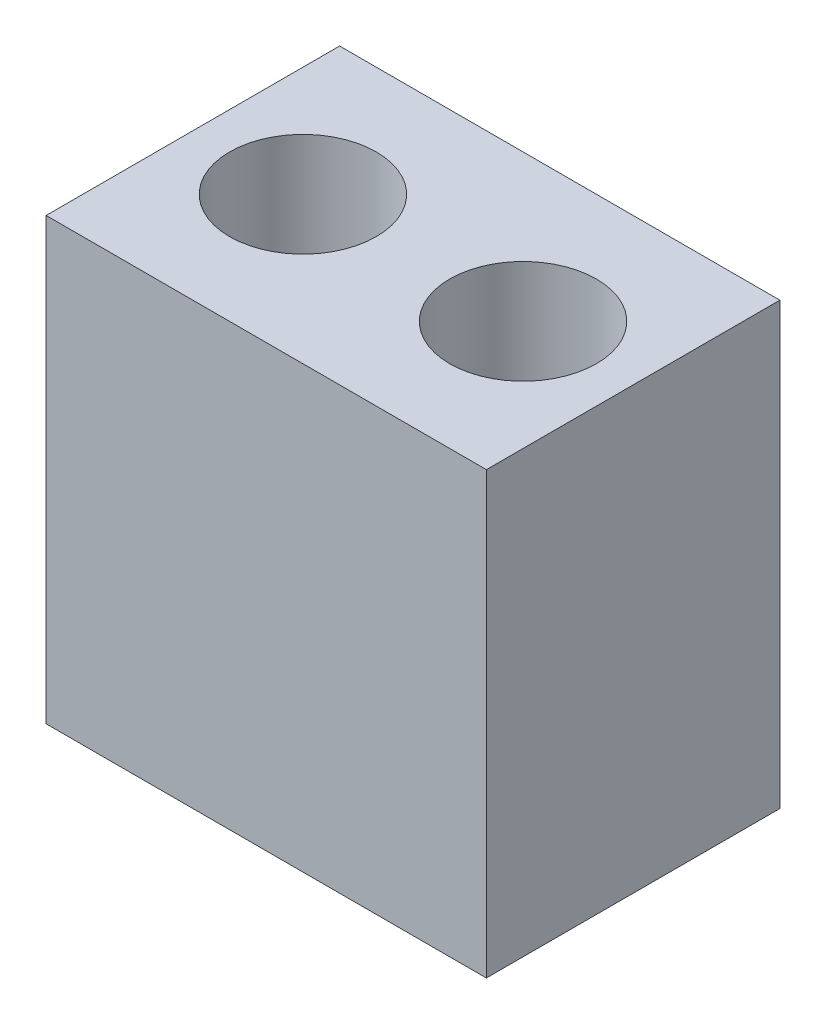
ISO-10303-21;
HEADER;
FILE_DESCRIPTION(('STEP AP214'),'2;1');
FILE_NAME('part.step','',(''),(''),'','','');
FILE_SCHEMA(('AUTOMOTIVE_DESIGN { 1 0 10303 214 1 1 1 1 }'));
ENDSEC;
DATA;
#1=APPLICATION_CONTEXT('core data for automotive mechanical design processes');
#2=APPLICATION_PROTOCOL_DEFINITION('international standard','automotive_design',2000,#1);
#3=PRODUCT_CONTEXT('',#1,'mechanical');
#4=PRODUCT('Part','Part','',(#3));
#5=PRODUCT_RELATED_PRODUCT_CATEGORY('part','',(#4));
#6=PRODUCT_DEFINITION_FORMATION('','',#4);
#7=PRODUCT_DEFINITION_CONTEXT('part definition',#1,'design');
#8=PRODUCT_DEFINITION('design','',#6,#7);
#9=PRODUCT_DEFINITION_SHAPE('','',#8);
#10=(LENGTH_UNIT() NAMED_UNIT(*) SI_UNIT(.MILLI.,.METRE.));
#11=(NAMED_UNIT(*) PLANE_ANGLE_UNIT() SI_UNIT($,.RADIAN.));
#12=(NAMED_UNIT(*) SI_UNIT($,.STERADIAN.) SOLID_ANGLE_UNIT());
#13=UNCERTAINTY_MEASURE_WITH_UNIT(LENGTH_MEASURE(1.E-05),#10,'distance_accuracy_value','');
#14=(GEOMETRIC_REPRESENTATION_CONTEXT(3) GLOBAL_UNCERTAINTY_ASSIGNED_CONTEXT((#13)) GLOBAL_UNIT_ASSIGNED_CONTEXT((#10,
#11,#12)) REPRESENTATION_CONTEXT('',''));
#15=CARTESIAN_POINT('',(0.,0.,0.));
#16=DIRECTION('',(0.,0.,1.));
#17=DIRECTION('',(1.,0.,0.));
#18=AXIS2_PLACEMENT_3D('',#15,#16,#17);
#19=CARTESIAN_POINT('',(7.5,-15.,10.));
#20=DIRECTION('',(0.,1.,0.));
#21=DIRECTION('',(0.,0.,1.));
#22=AXIS2_PLACEMENT_3D('',#19,#20,#21);
#23=CYLINDRICAL_SURFACE('',#22,2.53);
#24=CARTESIAN_POINT('',(7.5,-15.,10.));
#25=DIRECTION('',(0.,1.,0.));
#26=DIRECTION('',(0.,0.,1.));
#27=AXIS2_PLACEMENT_3D('',#24,#25,#26);
#28=CIRCLE('',#27,2.53);
#29=CARTESIAN_POINT('',(7.5,-15.,12.53));
#30=VERTEX_POINT('',#29);
#31=EDGE_CURVE('E113',#30,#30,#28,.T.);
#32=CARTESIAN_POINT('',(7.5,0.,10.));
#33=DIRECTION('',(0.,1.,0.));
#34=DIRECTION('',(0.,0.,1.));
#35=AXIS2_PLACEMENT_3D('',#32,#33,#34);
#36=CIRCLE('',#35,2.53);
#37=CARTESIAN_POINT('',(7.5,0.,12.53));
#38=VERTEX_POINT('',#37);
#39=EDGE_CURVE('E37',#38,#38,#36,.F.);
#40=CARTESIAN_POINT('',(7.5,-15.,12.53));
#41=CARTESIAN_POINT('',(7.5,-14.84375,12.53));
#42=CARTESIAN_POINT('',(7.5,-14.6875,12.53));
#43=CARTESIAN_POINT('',(7.5,-14.375,12.53));
#44=CARTESIAN_POINT('',(7.5,-14.21875,12.53));
#45=CARTESIAN_POINT('',(7.5,-13.90625,12.53));
#46=CARTESIAN_POINT('',(7.5,-13.75,12.53));
#47=CARTESIAN_POINT('',(7.5,-13.4375,12.53));
#48=CARTESIAN_POINT('',(7.5,-13.28125,12.53));
#49=CARTESIAN_POINT('',(7.5,-12.96875,12.53));
#50=CARTESIAN_POINT('',(7.5,-12.8125,12.53));
#51=CARTESIAN_POINT('',(7.5,-12.5,12.53));
#52=CARTESIAN_POINT('',(7.5,-12.34375,12.53));
#53=CARTESIAN_POINT('',(7.5,-12.03125,12.53));
#54=CARTESIAN_POINT('',(7.5,-11.875,12.53));
#55=CARTESIAN_POINT('',(7.5,-11.5625,12.53));
#56=CARTESIAN_POINT('',(7.5,-11.40625,12.53));
#57=CARTESIAN_POINT('',(7.5,-11.09375,12.53));
#58=CARTESIAN_POINT('',(7.5,-10.9375,12.53));
#59=CARTESIAN_POINT('',(7.5,-10.625,12.53));
#60=CARTESIAN_POINT('',(7.5,-10.46875,12.53));
#61=CARTESIAN_POINT('',(7.5,-10.15625,12.53));
#62=CARTESIAN_POINT('',(7.5,-10.,12.53));
#63=CARTESIAN_POINT('',(7.5,-9.6875,12.53));
#64=CARTESIAN_POINT('',(7.5,-9.53125,12.53));
#65=CARTESIAN_POINT('',(7.5,-9.21875,12.53));
#66=CARTESIAN_POINT('',(7.5,-9.0625,12.53));
#67=CARTESIAN_POINT('',(7.5,-8.75,12.53));
#68=CARTESIAN_POINT('',(7.5,-8.59375,12.53));
#69=CARTESIAN_POINT('',(7.5,-8.28125,12.53));
#70=CARTESIAN_POINT('',(7.5,-8.125,12.53));
#71=CARTESIAN_POINT('',(7.5,-7.8125,12.53));
#72=CARTESIAN_POINT('',(7.5,-7.65625,12.53));
#73=CARTESIAN_POINT('',(7.5,-7.34375,12.53));
#74=CARTESIAN_POINT('',(7.5,-7.1875,12.53));
#75=CARTESIAN_POINT('',(7.5,-6.875,12.53));
#76=CARTESIAN_POINT('',(7.5,-6.71875,12.53));
#77=CARTESIAN_POINT('',(7.5,-6.40625,12.53));
#78=CARTESIAN_POINT('',(7.5,-6.25,12.53));
#79=CARTESIAN_POINT('',(7.5,-5.9375,12.53));
#80=CARTESIAN_POINT('',(7.5,-5.78125,12.53));
#81=CARTESIAN_POINT('',(7.5,-5.46875,12.53));
#82=CARTESIAN_POINT('',(7.5,-5.3125,12.53));
#83=CARTESIAN_POINT('',(7.5,-5.,12.53));
#84=CARTESIAN_POINT('',(7.5,-4.84375,12.53));
#85=CARTESIAN_POINT('',(7.5,-4.53125,12.53));
#86=CARTESIAN_POINT('',(7.5,-4.375,12.53));
#87=CARTESIAN_POINT('',(7.5,-4.0625,12.53));
#88=CARTESIAN_POINT('',(7.5,-3.90625,12.53));
#89=CARTESIAN_POINT('',(7.5,-3.59375,12.53));
#90=CARTESIAN_POINT('',(7.5,-3.4375,12.53));
#91=CARTESIAN_POINT('',(7.5,-3.125,12.53));
#92=CARTESIAN_POINT('',(7.5,-2.96875,12.53));
#93=CARTESIAN_POINT('',(7.5,-2.65625,12.53));
#94=CARTESIAN_POINT('',(7.5,-2.5,12.53));
#95=CARTESIAN_POINT('',(7.5,-2.1875,12.53));
#96=CARTESIAN_POINT('',(7.5,-2.03125,12.53));
#97=CARTESIAN_POINT('',(7.5,-1.71875,12.53));
#98=CARTESIAN_POINT('',(7.5,-1.5625,12.53));
#99=CARTESIAN_POINT('',(7.5,-1.25,12.53));
#100=CARTESIAN_POINT('',(7.5,-1.09375,12.53));
#101=CARTESIAN_POINT('',(7.5,-0.781250000000005,12.53));
#102=CARTESIAN_POINT('',(7.5,-0.625000000000005,12.53));
#103=CARTESIAN_POINT('',(7.5,-0.312500000000005,12.53));
#104=CARTESIAN_POINT('',(7.5,-0.156250000000005,12.53));
#105=CARTESIAN_POINT('',(7.5,0.,12.53));
#106=B_SPLINE_CURVE_WITH_KNOTS('',3,(#40,#41,#42,#43,#44,#45,#46,#47,#48,#49,#50,#51,#52,#53,
#54,#55,#56,#57,#58,#59,#60,#61,#62,#63,#64,#65,#66,#67,#68,#69,#70,#71,#72,#73,#74,#75,#76,#77,
#78,#79,#80,#81,#82,#83,#84,#85,#86,#87,#88,#89,#90,#91,#92,#93,#94,#95,#96,#97,#98,#99,#100,
#101,#102,#103,#104,#105),.UNSPECIFIED.,.F.,.F.,(4,2,2,2,2,2,2,2,2,2,2,2,2,2,2,2,2,2,2,2,2,2,2,
2,2,2,2,2,2,2,2,2,4),(0.,0.468749999999999,0.937499999999999,1.40625,1.875,2.34375,2.8125,
3.28125,3.75,4.21875,4.6875,5.15625,5.625,6.09375,6.5625,7.03125,7.5,7.96875,8.43749999999999,
8.90625,9.375,9.84374999999999,10.3125,10.78125,11.25,11.71875,12.1875,12.65625,13.125,13.59375,
14.0625,14.53125,15.),.UNSPECIFIED.);
#107=EDGE_CURVE('BSEAM33',#30,#38,#106,.T.);
#108=ORIENTED_EDGE('',*,*,#31,.F.);
#109=ORIENTED_EDGE('',*,*,#39,.F.);
#110=ORIENTED_EDGE('',*,*,#107,.T.);
#111=ORIENTED_EDGE('',*,*,#107,.F.);
#112=EDGE_LOOP('',(#108,#110,#109,#111));
#113=FACE_BOUND('',#112,.T.);
#114=ADVANCED_FACE('F33',(#113),#23,.F.);
#115=CARTESIAN_POINT('',(-7.5,-15.,10.));
#116=DIRECTION('',(0.,1.,0.));
#117=DIRECTION('',(0.,0.,1.));
#118=AXIS2_PLACEMENT_3D('',#115,#116,#117);
#119=CYLINDRICAL_SURFACE('',#118,3.);
#120=CARTESIAN_POINT('',(-7.5,-15.,10.));
#121=DIRECTION('',(0.,1.,0.));
#122=DIRECTION('',(0.,0.,1.));
#123=AXIS2_PLACEMENT_3D('',#120,#121,#122);
#124=CIRCLE('',#123,3.);
#125=CARTESIAN_POINT('',(-7.5,-15.,13.));
#126=VERTEX_POINT('',#125);
#127=EDGE_CURVE('E106',#126,#126,#124,.T.);
#128=CARTESIAN_POINT('',(-7.5,0.,10.));
#129=DIRECTION('',(0.,1.,0.));
#130=DIRECTION('',(0.,0.,1.));
#131=AXIS2_PLACEMENT_3D('',#128,#129,#130);
#132=CIRCLE('',#131,3.);
#133=CARTESIAN_POINT('',(-7.5,0.,13.));
#134=VERTEX_POINT('',#133);
#135=EDGE_CURVE('E111',#134,#134,#132,.F.);
#136=CARTESIAN_POINT('',(-7.5,-15.,13.));
#137=CARTESIAN_POINT('',(-7.5,-14.84375,13.));
#138=CARTESIAN_POINT('',(-7.5,-14.6875,13.));
#139=CARTESIAN_POINT('',(-7.5,-14.375,13.));
#140=CARTESIAN_POINT('',(-7.5,-14.21875,13.));
#141=CARTESIAN_POINT('',(-7.5,-13.90625,13.));
#142=CARTESIAN_POINT('',(-7.5,-13.75,13.));
#143=CARTESIAN_POINT('',(-7.5,-13.4375,13.));
#144=CARTESIAN_POINT('',(-7.5,-13.28125,13.));
#145=CARTESIAN_POINT('',(-7.5,-12.96875,13.));
#146=CARTESIAN_POINT('',(-7.5,-12.8125,13.));
#147=CARTESIAN_POINT('',(-7.5,-12.5,13.));
#148=CARTESIAN_POINT('',(-7.5,-12.34375,13.));
#149=CARTESIAN_POINT('',(-7.5,-12.03125,13.));
#150=CARTESIAN_POINT('',(-7.5,-11.875,13.));
#151=CARTESIAN_POINT('',(-7.5,-11.5625,13.));
#152=CARTESIAN_POINT('',(-7.5,-11.40625,13.));
#153=CARTESIAN_POINT('',(-7.5,-11.09375,13.));
#154=CARTESIAN_POINT('',(-7.5,-10.9375,13.));
#155=CARTESIAN_POINT('',(-7.5,-10.625,13.));
#156=CARTESIAN_POINT('',(-7.5,-10.46875,13.));
#157=CARTESIAN_POINT('',(-7.5,-10.15625,13.));
#158=CARTESIAN_POINT('',(-7.5,-10.,13.));
#159=CARTESIAN_POINT('',(-7.5,-9.6875,13.));
#160=CARTESIAN_POINT('',(-7.5,-9.53125,13.));
#161=CARTESIAN_POINT('',(-7.5,-9.21875,13.));
#162=CARTESIAN_POINT('',(-7.5,-9.0625,13.));
#163=CARTESIAN_POINT('',(-7.5,-8.75,13.));
#164=CARTESIAN_POINT('',(-7.5,-8.59375,13.));
#165=CARTESIAN_POINT('',(-7.5,-8.28125,13.));
#166=CARTESIAN_POINT('',(-7.5,-8.125,13.));
#167=CARTESIAN_POINT('',(-7.5,-7.8125,13.));
#168=CARTESIAN_POINT('',(-7.5,-7.65625,13.));
#169=CARTESIAN_POINT('',(-7.5,-7.34375,13.));
#170=CARTESIAN_POINT('',(-7.5,-7.1875,13.));
#171=CARTESIAN_POINT('',(-7.5,-6.875,13.));
#172=CARTESIAN_POINT('',(-7.5,-6.71875,13.));
#173=CARTESIAN_POINT('',(-7.5,-6.40625,13.));
#174=CARTESIAN_POINT('',(-7.5,-6.25,13.));
#175=CARTESIAN_POINT('',(-7.5,-5.9375,13.));
#176=CARTESIAN_POINT('',(-7.5,-5.78125,13.));
#177=CARTESIAN_POINT('',(-7.5,-5.46875,13.));
#178=CARTESIAN_POINT('',(-7.5,-5.3125,13.));
#179=CARTESIAN_POINT('',(-7.5,-5.,13.));
#180=CARTESIAN_POINT('',(-7.5,-4.84375,13.));
#181=CARTESIAN_POINT('',(-7.5,-4.53125,13.));
#182=CARTESIAN_POINT('',(-7.5,-4.375,13.));
#183=CARTESIAN_POINT('',(-7.5,-4.0625,13.));
#184=CARTESIAN_POINT('',(-7.5,-3.90625,13.));
#185=CARTESIAN_POINT('',(-7.5,-3.59375,13.));
#186=CARTESIAN_POINT('',(-7.5,-3.4375,13.));
#187=CARTESIAN_POINT('',(-7.5,-3.125,13.));
#188=CARTESIAN_POINT('',(-7.5,-2.96875,13.));
#189=CARTESIAN_POINT('',(-7.5,-2.65625,13.));
#190=CARTESIAN_POINT('',(-7.5,-2.5,13.));
#191=CARTESIAN_POINT('',(-7.5,-2.1875,13.));
#192=CARTESIAN_POINT('',(-7.5,-2.03125,13.));
#193=CARTESIAN_POINT('',(-7.5,-1.71875,13.));
#194=CARTESIAN_POINT('',(-7.5,-1.5625,13.));
#195=CARTESIAN_POINT('',(-7.5,-1.25,13.));
#196=CARTESIAN_POINT('',(-7.5,-1.09375,13.));
#197=CARTESIAN_POINT('',(-7.5,-0.781250000000005,13.));
#198=CARTESIAN_POINT('',(-7.5,-0.625000000000005,13.));
#199=CARTESIAN_POINT('',(-7.5,-0.312500000000005,13.));
#200=CARTESIAN_POINT('',(-7.5,-0.156250000000005,13.));
#201=CARTESIAN_POINT('',(-7.5,0.,13.));
#202=B_SPLINE_CURVE_WITH_KNOTS('',3,(#136,#137,#138,#139,#140,#141,#142,#143,#144,#145,#146,
#147,#148,#149,#150,#151,#152,#153,#154,#155,#156,#157,#158,#159,#160,#161,#162,#163,#164,#165,
#166,#167,#168,#169,#170,#171,#172,#173,#174,#175,#176,#177,#178,#179,#180,#181,#182,#183,#184,
#185,#186,#187,#188,#189,#190,#191,#192,#193,#194,#195,#196,#197,#198,#199,#200,#201),
.UNSPECIFIED.,.F.,.F.,(4,2,2,2,2,2,2,2,2,2,2,2,2,2,2,2,2,2,2,2,2,2,2,2,2,2,2,2,2,2,2,2,4),(0.,
0.468749999999999,0.937499999999999,1.40625,1.875,2.34375,2.8125,3.28125,3.75,4.21875,4.6875,
5.15625,5.625,6.09375,6.5625,7.03125,7.5,7.96875,8.43749999999999,8.90625,9.375,
9.84374999999999,10.3125,10.78125,11.25,11.71875,12.1875,12.65625,13.125,13.59375,14.0625,
14.53125,15.),.UNSPECIFIED.);
#203=EDGE_CURVE('BSEAM133',#126,#134,#202,.T.);
#204=ORIENTED_EDGE('',*,*,#127,.F.);
#205=ORIENTED_EDGE('',*,*,#135,.F.);
#206=ORIENTED_EDGE('',*,*,#203,.T.);
#207=ORIENTED_EDGE('',*,*,#203,.F.);
#208=EDGE_LOOP('',(#204,#206,#205,#207));
#209=FACE_BOUND('',#208,.T.);
#210=ADVANCED_FACE('F133',(#209),#119,.F.);
#211=CARTESIAN_POINT('',(-15.,15.,20.));
#212=DIRECTION('',(0.,1.,0.));
#213=DIRECTION('',(0.,0.,1.));
#214=AXIS2_PLACEMENT_3D('',#211,#212,#213);
#215=PLANE('',#214);
#216=CARTESIAN_POINT('',(7.5,15.,10.));
#217=DIRECTION('',(0.,1.,0.));
#218=DIRECTION('',(0.,0.,1.));
#219=AXIS2_PLACEMENT_3D('',#216,#217,#218);
#220=CIRCLE('',#219,5.);
#221=CARTESIAN_POINT('',(7.5,15.,15.));
#222=VERTEX_POINT('',#221);
#223=EDGE_CURVE('E127',#222,#222,#220,.T.);
#224=ORIENTED_EDGE('',*,*,#223,.F.);
#225=EDGE_LOOP('',(#224));
#226=FACE_BOUND('',#225,.T.);
#227=CARTESIAN_POINT('',(-7.5,15.,10.));
#228=DIRECTION('',(0.,1.,0.));
#229=DIRECTION('',(0.,0.,1.));
#230=AXIS2_PLACEMENT_3D('',#227,#228,#229);
#231=CIRCLE('',#230,5.);
#232=CARTESIAN_POINT('',(-7.5,15.,15.));
#233=VERTEX_POINT('',#232);
#234=EDGE_CURVE('E120',#233,#233,#231,.T.);
#235=ORIENTED_EDGE('',*,*,#234,.F.);
#236=EDGE_LOOP('',(#235));
#237=FACE_BOUND('',#236,.T.);
#238=DIRECTION('',(1.,0.,0.));
#239=VECTOR('',#238,1.);
#240=CARTESIAN_POINT('',(-15.,15.,0.));
#241=LINE('',#240,#239);
#242=CARTESIAN_POINT('',(-15.,15.,0.));
#243=VERTEX_POINT('',#242);
#244=CARTESIAN_POINT('',(15.,15.,0.));
#245=VERTEX_POINT('',#244);
#246=EDGE_CURVE('E102',#243,#245,#241,.T.);
#247=ORIENTED_EDGE('',*,*,#246,.F.);
#248=DIRECTION('',(0.,0.,-1.));
#249=VECTOR('',#248,1.);
#250=CARTESIAN_POINT('',(-15.,15.,20.));
#251=LINE('',#250,#249);
#252=CARTESIAN_POINT('',(-15.,15.,20.));
#253=VERTEX_POINT('',#252);
#254=EDGE_CURVE('E11',#253,#243,#251,.T.);
#255=ORIENTED_EDGE('',*,*,#254,.F.);
#256=DIRECTION('',(1.,0.,0.));
#257=VECTOR('',#256,1.);
#258=CARTESIAN_POINT('',(-15.,15.,20.));
#259=LINE('',#258,#257);
#260=CARTESIAN_POINT('',(15.,15.,20.));
#261=VERTEX_POINT('',#260);
#262=EDGE_CURVE('E96',#253,#261,#259,.T.);
#263=ORIENTED_EDGE('',*,*,#262,.T.);
#264=DIRECTION('',(0.,0.,-1.));
#265=VECTOR('',#264,1.);
#266=CARTESIAN_POINT('',(15.,15.,20.));
#267=LINE('',#266,#265);
#268=EDGE_CURVE('E75',#261,#245,#267,.T.);
#269=ORIENTED_EDGE('',*,*,#268,.T.);
#270=EDGE_LOOP('',(#247,#255,#263,#269));
#271=FACE_BOUND('',#270,.T.);
#272=ADVANCED_FACE('F35',(#226,#237,#271),#215,.T.);
#273=CARTESIAN_POINT('',(-15.,15.,20.));
#274=DIRECTION('',(1.,0.,0.));
#275=DIRECTION('',(0.,1.,0.));
#276=AXIS2_PLACEMENT_3D('',#273,#274,#275);
#277=PLANE('',#276);
#278=DIRECTION('',(0.,-1.,0.));
#279=VECTOR('',#278,1.);
#280=CARTESIAN_POINT('',(-15.,15.,0.));
#281=LINE('',#280,#279);
#282=CARTESIAN_POINT('',(-15.,-15.,0.));
#283=VERTEX_POINT('',#282);
#284=EDGE_CURVE('E67',#243,#283,#281,.T.);
#285=ORIENTED_EDGE('',*,*,#284,.T.);
#286=DIRECTION('',(0.,0.,-1.));
#287=VECTOR('',#286,1.);
#288=CARTESIAN_POINT('',(-15.,-15.,20.));
#289=LINE('',#288,#287);
#290=CARTESIAN_POINT('',(-15.,-15.,20.));
#291=VERTEX_POINT('',#290);
#292=EDGE_CURVE('E43',#291,#283,#289,.T.);
#293=ORIENTED_EDGE('',*,*,#292,.F.);
#294=DIRECTION('',(0.,-1.,0.));
#295=VECTOR('',#294,1.);
#296=CARTESIAN_POINT('',(-15.,15.,20.));
#297=LINE('',#296,#295);
#298=EDGE_CURVE('E85',#253,#291,#297,.T.);
#299=ORIENTED_EDGE('',*,*,#298,.F.);
#300=ORIENTED_EDGE('',*,*,#254,.T.);
#301=EDGE_LOOP('',(#285,#293,#299,#300));
#302=FACE_BOUND('',#301,.T.);
#303=ADVANCED_FACE('F141',(#302),#277,.F.);
#304=CARTESIAN_POINT('',(-15.,-15.,20.));
#305=DIRECTION('',(0.,1.,0.));
#306=DIRECTION('',(0.,0.,1.));
#307=AXIS2_PLACEMENT_3D('',#304,#305,#306);
#308=PLANE('',#307);
#309=ORIENTED_EDGE('',*,*,#31,.T.);
#310=EDGE_LOOP('',(#309));
#311=FACE_BOUND('',#310,.T.);
#312=ORIENTED_EDGE('',*,*,#127,.T.);
#313=EDGE_LOOP('',(#312));
#314=FACE_BOUND('',#313,.T.);
#315=DIRECTION('',(1.,0.,0.));
#316=VECTOR('',#315,1.);
#317=CARTESIAN_POINT('',(-15.,-15.,0.));
#318=LINE('',#317,#316);
#319=CARTESIAN_POINT('',(15.,-15.,0.));
#320=VERTEX_POINT('',#319);
#321=EDGE_CURVE('E92',#283,#320,#318,.T.);
#322=ORIENTED_EDGE('',*,*,#321,.T.);
#323=DIRECTION('',(0.,0.,-1.));
#324=VECTOR('',#323,1.);
#325=CARTESIAN_POINT('',(15.,-15.,20.));
#326=LINE('',#325,#324);
#327=CARTESIAN_POINT('',(15.,-15.,20.));
#328=VERTEX_POINT('',#327);
#329=EDGE_CURVE('E89',#328,#320,#326,.T.);
#330=ORIENTED_EDGE('',*,*,#329,.F.);
#331=DIRECTION('',(1.,0.,0.));
#332=VECTOR('',#331,1.);
#333=CARTESIAN_POINT('',(-15.,-15.,20.));
#334=LINE('',#333,#332);
#335=EDGE_CURVE('E80',#291,#328,#334,.T.);
#336=ORIENTED_EDGE('',*,*,#335,.F.);
#337=ORIENTED_EDGE('',*,*,#292,.T.);
#338=EDGE_LOOP('',(#322,#330,#336,#337));
#339=FACE_BOUND('',#338,.T.);
#340=ADVANCED_FACE('F90',(#311,#314,#339),#308,.F.);
#341=CARTESIAN_POINT('',(15.,15.,20.));
#342=DIRECTION('',(1.,0.,0.));
#343=DIRECTION('',(0.,1.,0.));
#344=AXIS2_PLACEMENT_3D('',#341,#342,#343);
#345=PLANE('',#344);
#346=DIRECTION('',(0.,-1.,0.));
#347=VECTOR('',#346,1.);
#348=CARTESIAN_POINT('',(15.,15.,0.));
#349=LINE('',#348,#347);
#350=EDGE_CURVE('E105',#245,#320,#349,.T.);
#351=ORIENTED_EDGE('',*,*,#350,.F.);
#352=ORIENTED_EDGE('',*,*,#268,.F.);
#353=DIRECTION('',(0.,-1.,0.));
#354=VECTOR('',#353,1.);
#355=CARTESIAN_POINT('',(15.,15.,20.));
#356=LINE('',#355,#354);
#357=EDGE_CURVE('E84',#261,#328,#356,.T.);
#358=ORIENTED_EDGE('',*,*,#357,.T.);
#359=ORIENTED_EDGE('',*,*,#329,.T.);
#360=EDGE_LOOP('',(#351,#352,#358,#359));
#361=FACE_BOUND('',#360,.T.);
#362=ADVANCED_FACE('F95',(#361),#345,.T.);
#363=CARTESIAN_POINT('',(0.,0.,20.));
#364=DIRECTION('',(0.,0.,-1.));
#365=DIRECTION('',(-1.,0.,0.));
#366=AXIS2_PLACEMENT_3D('',#363,#364,#365);
#367=PLANE('',#366);
#368=ORIENTED_EDGE('',*,*,#262,.F.);
#369=ORIENTED_EDGE('',*,*,#298,.T.);
#370=ORIENTED_EDGE('',*,*,#335,.T.);
#371=ORIENTED_EDGE('',*,*,#357,.F.);
#372=EDGE_LOOP('',(#368,#369,#370,#371));
#373=FACE_BOUND('',#372,.T.);
#374=ADVANCED_FACE('F83',(#373),#367,.F.);
#375=CARTESIAN_POINT('',(0.,0.,0.));
#376=DIRECTION('',(0.,0.,-1.));
#377=DIRECTION('',(-1.,0.,0.));
#378=AXIS2_PLACEMENT_3D('',#375,#376,#377);
#379=PLANE('',#378);
#380=ORIENTED_EDGE('',*,*,#246,.T.);
#381=ORIENTED_EDGE('',*,*,#350,.T.);
#382=ORIENTED_EDGE('',*,*,#321,.F.);
#383=ORIENTED_EDGE('',*,*,#284,.F.);
#384=EDGE_LOOP('',(#380,#381,#382,#383));
#385=FACE_BOUND('',#384,.T.);
#386=ADVANCED_FACE('F149',(#385),#379,.T.);
#387=CARTESIAN_POINT('',(-7.5,0.,10.));
#388=DIRECTION('',(0.,1.,0.));
#389=DIRECTION('',(0.,0.,1.));
#390=AXIS2_PLACEMENT_3D('',#387,#388,#389);
#391=PLANE('',#390);
#392=CARTESIAN_POINT('',(-7.5,0.,10.));
#393=DIRECTION('',(0.,1.,0.));
#394=DIRECTION('',(0.,0.,1.));
#395=AXIS2_PLACEMENT_3D('',#392,#393,#394);
#396=CIRCLE('',#395,5.);
#397=CARTESIAN_POINT('',(-7.5,0.,15.));
#398=VERTEX_POINT('',#397);
#399=EDGE_CURVE('E114',#398,#398,#396,.T.);
#400=ORIENTED_EDGE('',*,*,#399,.T.);
#401=EDGE_LOOP('',(#400));
#402=FACE_BOUND('',#401,.T.);
#403=ORIENTED_EDGE('',*,*,#135,.T.);
#404=EDGE_LOOP('',(#403));
#405=FACE_BOUND('',#404,.T.);
#406=ADVANCED_FACE('F152',(#402,#405),#391,.T.);
#407=CARTESIAN_POINT('',(-7.5,0.,10.));
#408=DIRECTION('',(0.,1.,0.));
#409=DIRECTION('',(0.,0.,1.));
#410=AXIS2_PLACEMENT_3D('',#407,#408,#409);
#411=CYLINDRICAL_SURFACE('',#410,5.);
#412=ORIENTED_EDGE('',*,*,#399,.F.);
#413=EDGE_LOOP('',(#412));
#414=FACE_BOUND('',#413,.T.);
#415=ORIENTED_EDGE('',*,*,#234,.T.);
#416=EDGE_LOOP('',(#415));
#417=FACE_BOUND('',#416,.T.);
#418=ADVANCED_FACE('F178',(#414,#417),#411,.F.);
#419=CARTESIAN_POINT('',(7.5,0.,10.));
#420=DIRECTION('',(0.,1.,0.));
#421=DIRECTION('',(0.,0.,1.));
#422=AXIS2_PLACEMENT_3D('',#419,#420,#421);
#423=PLANE('',#422);
#424=CARTESIAN_POINT('',(7.5,0.,10.));
#425=DIRECTION('',(0.,1.,0.));
#426=DIRECTION('',(0.,0.,1.));
#427=AXIS2_PLACEMENT_3D('',#424,#425,#426);
#428=CIRCLE('',#427,5.);
#429=CARTESIAN_POINT('',(7.5,0.,15.));
#430=VERTEX_POINT('',#429);
#431=EDGE_CURVE('E245',#430,#430,#428,.T.);
#432=ORIENTED_EDGE('',*,*,#431,.T.);
#433=EDGE_LOOP('',(#432));
#434=FACE_BOUND('',#433,.T.);
#435=ORIENTED_EDGE('',*,*,#39,.T.);
#436=EDGE_LOOP('',(#435));
#437=FACE_BOUND('',#436,.T.);
#438=ADVANCED_FACE('F186',(#434,#437),#423,.T.);
#439=CARTESIAN_POINT('',(7.5,0.,10.));
#440=DIRECTION('',(0.,1.,0.));
#441=DIRECTION('',(0.,0.,1.));
#442=AXIS2_PLACEMENT_3D('',#439,#440,#441);
#443=CYLINDRICAL_SURFACE('',#442,5.);
#444=ORIENTED_EDGE('',*,*,#431,.F.);
#445=EDGE_LOOP('',(#444));
#446=FACE_BOUND('',#445,.T.);
#447=ORIENTED_EDGE('',*,*,#223,.T.);
#448=EDGE_LOOP('',(#447));
#449=FACE_BOUND('',#448,.T.);
#450=ADVANCED_FACE('F193',(#446,#449),#443,.F.);
#451=CLOSED_SHELL('',(#114,#210,#272,#303,#340,#362,#374,#386,#406,#418,#438,#450));
#452=MANIFOLD_SOLID_BREP('B2',#451);
#453=ADVANCED_BREP_SHAPE_REPRESENTATION('',(#18,#452),#14);
#454=SHAPE_DEFINITION_REPRESENTATION(#9,#453);
ENDSEC;
END-ISO-10303-21;
